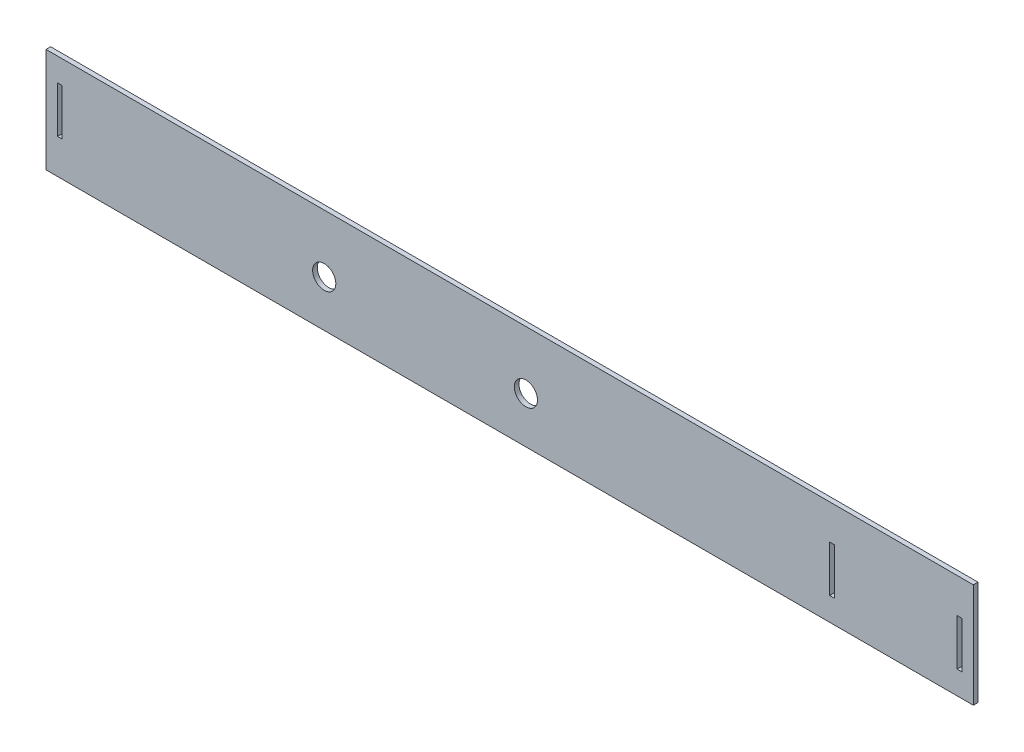
ISO-10303-21;
HEADER;
FILE_DESCRIPTION(('STEP AP214'),'2;1');
FILE_NAME('part.step','',(''),(''),'','','');
FILE_SCHEMA(('AUTOMOTIVE_DESIGN { 1 0 10303 214 1 1 1 1 }'));
ENDSEC;
DATA;
#1=APPLICATION_CONTEXT('core data for automotive mechanical design processes');
#2=APPLICATION_PROTOCOL_DEFINITION('international standard','automotive_design',2000,#1);
#3=PRODUCT_CONTEXT('',#1,'mechanical');
#4=PRODUCT('Part','Part','',(#3));
#5=PRODUCT_RELATED_PRODUCT_CATEGORY('part','',(#4));
#6=PRODUCT_DEFINITION_FORMATION('','',#4);
#7=PRODUCT_DEFINITION_CONTEXT('part definition',#1,'design');
#8=PRODUCT_DEFINITION('design','',#6,#7);
#9=PRODUCT_DEFINITION_SHAPE('','',#8);
#10=(LENGTH_UNIT() NAMED_UNIT(*) SI_UNIT(.MILLI.,.METRE.));
#11=(NAMED_UNIT(*) PLANE_ANGLE_UNIT() SI_UNIT($,.RADIAN.));
#12=(NAMED_UNIT(*) SI_UNIT($,.STERADIAN.) SOLID_ANGLE_UNIT());
#13=UNCERTAINTY_MEASURE_WITH_UNIT(LENGTH_MEASURE(1.E-05),#10,'distance_accuracy_value','');
#14=(GEOMETRIC_REPRESENTATION_CONTEXT(3) GLOBAL_UNCERTAINTY_ASSIGNED_CONTEXT((#13)) GLOBAL_UNIT_ASSIGNED_CONTEXT((#10,
#11,#12)) REPRESENTATION_CONTEXT('',''));
#15=CARTESIAN_POINT('',(0.,0.,0.));
#16=DIRECTION('',(0.,0.,1.));
#17=DIRECTION('',(1.,0.,0.));
#18=AXIS2_PLACEMENT_3D('',#15,#16,#17);
#19=CARTESIAN_POINT('',(0.,0.,2.));
#20=DIRECTION('',(0.,0.,-1.));
#21=DIRECTION('',(-1.,0.,0.));
#22=AXIS2_PLACEMENT_3D('',#19,#20,#21);
#23=PLANE('',#22);
#24=DIRECTION('',(0.,-1.,0.));
#25=VECTOR('',#24,1.);
#26=CARTESIAN_POINT('',(393.,30.,2.));
#27=LINE('',#26,#25);
#28=CARTESIAN_POINT('',(393.,30.,2.));
#29=VERTEX_POINT('',#28);
#30=CARTESIAN_POINT('',(393.,10.,2.));
#31=VERTEX_POINT('',#30);
#32=EDGE_CURVE('E184',#29,#31,#27,.T.);
#33=ORIENTED_EDGE('',*,*,#32,.F.);
#34=DIRECTION('',(-1.,0.,0.));
#35=VECTOR('',#34,1.);
#36=CARTESIAN_POINT('',(393.,30.,2.));
#37=LINE('',#36,#35);
#38=CARTESIAN_POINT('',(395.,30.,2.));
#39=VERTEX_POINT('',#38);
#40=EDGE_CURVE('E192',#39,#29,#37,.T.);
#41=ORIENTED_EDGE('',*,*,#40,.F.);
#42=DIRECTION('',(0.,1.,0.));
#43=VECTOR('',#42,1.);
#44=CARTESIAN_POINT('',(395.,30.,2.));
#45=LINE('',#44,#43);
#46=CARTESIAN_POINT('',(395.,10.,2.));
#47=VERTEX_POINT('',#46);
#48=EDGE_CURVE('E189',#47,#39,#45,.T.);
#49=ORIENTED_EDGE('',*,*,#48,.F.);
#50=DIRECTION('',(1.,0.,0.));
#51=VECTOR('',#50,1.);
#52=CARTESIAN_POINT('',(393.,10.,2.));
#53=LINE('',#52,#51);
#54=EDGE_CURVE('E186',#31,#47,#53,.T.);
#55=ORIENTED_EDGE('',*,*,#54,.F.);
#56=EDGE_LOOP('',(#33,#41,#49,#55));
#57=FACE_BOUND('',#56,.T.);
#58=CARTESIAN_POINT('',(207.,20.,2.));
#59=DIRECTION('',(0.,0.,1.));
#60=DIRECTION('',(1.,0.,0.));
#61=AXIS2_PLACEMENT_3D('',#58,#59,#60);
#62=CIRCLE('',#61,4.99999999999999);
#63=CARTESIAN_POINT('',(212.,20.,2.));
#64=VERTEX_POINT('',#63);
#65=EDGE_CURVE('E246',#64,#64,#62,.T.);
#66=ORIENTED_EDGE('',*,*,#65,.F.);
#67=EDGE_LOOP('',(#66));
#68=FACE_BOUND('',#67,.T.);
#69=CARTESIAN_POINT('',(120.,20.,2.));
#70=DIRECTION('',(0.,0.,1.));
#71=DIRECTION('',(1.,0.,0.));
#72=AXIS2_PLACEMENT_3D('',#69,#70,#71);
#73=CIRCLE('',#72,4.99999999999999);
#74=CARTESIAN_POINT('',(125.,20.,2.));
#75=VERTEX_POINT('',#74);
#76=EDGE_CURVE('E252',#75,#75,#73,.T.);
#77=ORIENTED_EDGE('',*,*,#76,.F.);
#78=EDGE_LOOP('',(#77));
#79=FACE_BOUND('',#78,.T.);
#80=DIRECTION('',(0.,-1.,0.));
#81=VECTOR('',#80,1.);
#82=CARTESIAN_POINT('',(0.,0.,2.));
#83=LINE('',#82,#81);
#84=CARTESIAN_POINT('',(0.,45.,2.));
#85=VERTEX_POINT('',#84);
#86=CARTESIAN_POINT('',(0.,0.,2.));
#87=VERTEX_POINT('',#86);
#88=EDGE_CURVE('E258',#85,#87,#83,.T.);
#89=ORIENTED_EDGE('',*,*,#88,.T.);
#90=DIRECTION('',(1.,0.,0.));
#91=VECTOR('',#90,1.);
#92=CARTESIAN_POINT('',(0.,0.,2.));
#93=LINE('',#92,#91);
#94=CARTESIAN_POINT('',(400.,0.,2.));
#95=VERTEX_POINT('',#94);
#96=EDGE_CURVE('E261',#87,#95,#93,.T.);
#97=ORIENTED_EDGE('',*,*,#96,.T.);
#98=DIRECTION('',(0.,1.,0.));
#99=VECTOR('',#98,1.);
#100=CARTESIAN_POINT('',(400.,0.,2.));
#101=LINE('',#100,#99);
#102=CARTESIAN_POINT('',(400.,45.,2.));
#103=VERTEX_POINT('',#102);
#104=EDGE_CURVE('E264',#95,#103,#101,.T.);
#105=ORIENTED_EDGE('',*,*,#104,.T.);
#106=DIRECTION('',(-1.,0.,0.));
#107=VECTOR('',#106,1.);
#108=CARTESIAN_POINT('',(0.,45.,2.));
#109=LINE('',#108,#107);
#110=EDGE_CURVE('E266',#103,#85,#109,.T.);
#111=ORIENTED_EDGE('',*,*,#110,.T.);
#112=EDGE_LOOP('',(#89,#97,#105,#111));
#113=FACE_BOUND('',#112,.T.);
#114=DIRECTION('',(0.,-1.,0.));
#115=VECTOR('',#114,1.);
#116=CARTESIAN_POINT('',(338.,30.,2.));
#117=LINE('',#116,#115);
#118=CARTESIAN_POINT('',(338.,30.,2.));
#119=VERTEX_POINT('',#118);
#120=CARTESIAN_POINT('',(338.,10.,2.));
#121=VERTEX_POINT('',#120);
#122=EDGE_CURVE('E215',#119,#121,#117,.T.);
#123=ORIENTED_EDGE('',*,*,#122,.F.);
#124=DIRECTION('',(-1.,0.,0.));
#125=VECTOR('',#124,1.);
#126=CARTESIAN_POINT('',(338.,30.,2.));
#127=LINE('',#126,#125);
#128=CARTESIAN_POINT('',(340.,30.,2.));
#129=VERTEX_POINT('',#128);
#130=EDGE_CURVE('E223',#129,#119,#127,.T.);
#131=ORIENTED_EDGE('',*,*,#130,.F.);
#132=DIRECTION('',(0.,1.,0.));
#133=VECTOR('',#132,1.);
#134=CARTESIAN_POINT('',(340.,30.,2.));
#135=LINE('',#134,#133);
#136=CARTESIAN_POINT('',(340.,10.,2.));
#137=VERTEX_POINT('',#136);
#138=EDGE_CURVE('E220',#137,#129,#135,.T.);
#139=ORIENTED_EDGE('',*,*,#138,.F.);
#140=DIRECTION('',(1.,0.,0.));
#141=VECTOR('',#140,1.);
#142=CARTESIAN_POINT('',(338.,10.,2.));
#143=LINE('',#142,#141);
#144=EDGE_CURVE('E217',#121,#137,#143,.T.);
#145=ORIENTED_EDGE('',*,*,#144,.F.);
#146=EDGE_LOOP('',(#123,#131,#139,#145));
#147=FACE_BOUND('',#146,.T.);
#148=DIRECTION('',(0.,-1.,0.));
#149=VECTOR('',#148,1.);
#150=CARTESIAN_POINT('',(5.,35.,2.));
#151=LINE('',#150,#149);
#152=CARTESIAN_POINT('',(5.,35.,2.));
#153=VERTEX_POINT('',#152);
#154=CARTESIAN_POINT('',(5.,15.,2.));
#155=VERTEX_POINT('',#154);
#156=EDGE_CURVE('E148',#153,#155,#151,.T.);
#157=ORIENTED_EDGE('',*,*,#156,.F.);
#158=DIRECTION('',(-1.,0.,0.));
#159=VECTOR('',#158,1.);
#160=CARTESIAN_POINT('',(5.,35.,2.));
#161=LINE('',#160,#159);
#162=CARTESIAN_POINT('',(7.,35.,2.));
#163=VERTEX_POINT('',#162);
#164=EDGE_CURVE('E170',#163,#153,#161,.T.);
#165=ORIENTED_EDGE('',*,*,#164,.F.);
#166=DIRECTION('',(0.,1.,0.));
#167=VECTOR('',#166,1.);
#168=CARTESIAN_POINT('',(7.,35.,2.));
#169=LINE('',#168,#167);
#170=CARTESIAN_POINT('',(7.,15.,2.));
#171=VERTEX_POINT('',#170);
#172=EDGE_CURVE('E168',#171,#163,#169,.T.);
#173=ORIENTED_EDGE('',*,*,#172,.F.);
#174=DIRECTION('',(1.,0.,0.));
#175=VECTOR('',#174,1.);
#176=CARTESIAN_POINT('',(5.,15.,2.));
#177=LINE('',#176,#175);
#178=EDGE_CURVE('E156',#155,#171,#177,.T.);
#179=ORIENTED_EDGE('',*,*,#178,.F.);
#180=EDGE_LOOP('',(#157,#165,#173,#179));
#181=FACE_BOUND('',#180,.T.);
#182=ADVANCED_FACE('F35',(#57,#68,#79,#113,#147,#181),#23,.F.);
#183=CARTESIAN_POINT('',(0.,0.,0.));
#184=DIRECTION('',(0.,0.,-1.));
#185=DIRECTION('',(-1.,0.,0.));
#186=AXIS2_PLACEMENT_3D('',#183,#184,#185);
#187=PLANE('',#186);
#188=CARTESIAN_POINT('',(120.,20.,0.));
#189=DIRECTION('',(0.,0.,1.));
#190=DIRECTION('',(1.,0.,0.));
#191=AXIS2_PLACEMENT_3D('',#188,#189,#190);
#192=CIRCLE('',#191,4.99999999999999);
#193=CARTESIAN_POINT('',(125.,20.,0.));
#194=VERTEX_POINT('',#193);
#195=EDGE_CURVE('E249',#194,#194,#192,.T.);
#196=ORIENTED_EDGE('',*,*,#195,.T.);
#197=EDGE_LOOP('',(#196));
#198=FACE_BOUND('',#197,.T.);
#199=DIRECTION('',(0.,-1.,0.));
#200=VECTOR('',#199,1.);
#201=CARTESIAN_POINT('',(0.,0.,0.));
#202=LINE('',#201,#200);
#203=CARTESIAN_POINT('',(0.,45.,0.));
#204=VERTEX_POINT('',#203);
#205=CARTESIAN_POINT('',(0.,0.,0.));
#206=VERTEX_POINT('',#205);
#207=EDGE_CURVE('E255',#204,#206,#202,.T.);
#208=ORIENTED_EDGE('',*,*,#207,.F.);
#209=DIRECTION('',(-1.,0.,0.));
#210=VECTOR('',#209,1.);
#211=CARTESIAN_POINT('',(0.,45.,0.));
#212=LINE('',#211,#210);
#213=CARTESIAN_POINT('',(400.,45.,0.));
#214=VERTEX_POINT('',#213);
#215=EDGE_CURVE('E262',#214,#204,#212,.T.);
#216=ORIENTED_EDGE('',*,*,#215,.F.);
#217=DIRECTION('',(0.,1.,0.));
#218=VECTOR('',#217,1.);
#219=CARTESIAN_POINT('',(400.,0.,0.));
#220=LINE('',#219,#218);
#221=CARTESIAN_POINT('',(400.,0.,0.));
#222=VERTEX_POINT('',#221);
#223=EDGE_CURVE('E273',#222,#214,#220,.T.);
#224=ORIENTED_EDGE('',*,*,#223,.F.);
#225=DIRECTION('',(1.,0.,0.));
#226=VECTOR('',#225,1.);
#227=CARTESIAN_POINT('',(0.,0.,0.));
#228=LINE('',#227,#226);
#229=EDGE_CURVE('E271',#206,#222,#228,.T.);
#230=ORIENTED_EDGE('',*,*,#229,.F.);
#231=EDGE_LOOP('',(#208,#216,#224,#230));
#232=FACE_BOUND('',#231,.T.);
#233=CARTESIAN_POINT('',(207.,20.,0.));
#234=DIRECTION('',(0.,0.,1.));
#235=DIRECTION('',(1.,0.,0.));
#236=AXIS2_PLACEMENT_3D('',#233,#234,#235);
#237=CIRCLE('',#236,4.99999999999999);
#238=CARTESIAN_POINT('',(212.,20.,0.));
#239=VERTEX_POINT('',#238);
#240=EDGE_CURVE('E245',#239,#239,#237,.T.);
#241=ORIENTED_EDGE('',*,*,#240,.T.);
#242=EDGE_LOOP('',(#241));
#243=FACE_BOUND('',#242,.T.);
#244=DIRECTION('',(-1.,0.,0.));
#245=VECTOR('',#244,1.);
#246=CARTESIAN_POINT('',(338.,30.,0.));
#247=LINE('',#246,#245);
#248=CARTESIAN_POINT('',(340.,30.,0.));
#249=VERTEX_POINT('',#248);
#250=CARTESIAN_POINT('',(338.,30.,0.));
#251=VERTEX_POINT('',#250);
#252=EDGE_CURVE('E218',#249,#251,#247,.T.);
#253=ORIENTED_EDGE('',*,*,#252,.T.);
#254=DIRECTION('',(0.,-1.,0.));
#255=VECTOR('',#254,1.);
#256=CARTESIAN_POINT('',(338.,30.,0.));
#257=LINE('',#256,#255);
#258=CARTESIAN_POINT('',(338.,10.,0.));
#259=VERTEX_POINT('',#258);
#260=EDGE_CURVE('E214',#251,#259,#257,.T.);
#261=ORIENTED_EDGE('',*,*,#260,.T.);
#262=DIRECTION('',(1.,0.,0.));
#263=VECTOR('',#262,1.);
#264=CARTESIAN_POINT('',(338.,10.,0.));
#265=LINE('',#264,#263);
#266=CARTESIAN_POINT('',(340.,10.,0.));
#267=VERTEX_POINT('',#266);
#268=EDGE_CURVE('E228',#259,#267,#265,.T.);
#269=ORIENTED_EDGE('',*,*,#268,.T.);
#270=DIRECTION('',(0.,1.,0.));
#271=VECTOR('',#270,1.);
#272=CARTESIAN_POINT('',(340.,30.,0.));
#273=LINE('',#272,#271);
#274=EDGE_CURVE('E231',#267,#249,#273,.T.);
#275=ORIENTED_EDGE('',*,*,#274,.T.);
#276=EDGE_LOOP('',(#253,#261,#269,#275));
#277=FACE_BOUND('',#276,.T.);
#278=DIRECTION('',(-1.,0.,0.));
#279=VECTOR('',#278,1.);
#280=CARTESIAN_POINT('',(393.,30.,0.));
#281=LINE('',#280,#279);
#282=CARTESIAN_POINT('',(395.,30.,0.));
#283=VERTEX_POINT('',#282);
#284=CARTESIAN_POINT('',(393.,30.,0.));
#285=VERTEX_POINT('',#284);
#286=EDGE_CURVE('E187',#283,#285,#281,.T.);
#287=ORIENTED_EDGE('',*,*,#286,.T.);
#288=DIRECTION('',(0.,-1.,0.));
#289=VECTOR('',#288,1.);
#290=CARTESIAN_POINT('',(393.,30.,0.));
#291=LINE('',#290,#289);
#292=CARTESIAN_POINT('',(393.,10.,0.));
#293=VERTEX_POINT('',#292);
#294=EDGE_CURVE('E164',#285,#293,#291,.T.);
#295=ORIENTED_EDGE('',*,*,#294,.T.);
#296=DIRECTION('',(1.,0.,0.));
#297=VECTOR('',#296,1.);
#298=CARTESIAN_POINT('',(393.,10.,0.));
#299=LINE('',#298,#297);
#300=CARTESIAN_POINT('',(395.,10.,0.));
#301=VERTEX_POINT('',#300);
#302=EDGE_CURVE('E197',#293,#301,#299,.T.);
#303=ORIENTED_EDGE('',*,*,#302,.T.);
#304=DIRECTION('',(0.,1.,0.));
#305=VECTOR('',#304,1.);
#306=CARTESIAN_POINT('',(395.,30.,0.));
#307=LINE('',#306,#305);
#308=EDGE_CURVE('E200',#301,#283,#307,.T.);
#309=ORIENTED_EDGE('',*,*,#308,.T.);
#310=EDGE_LOOP('',(#287,#295,#303,#309));
#311=FACE_BOUND('',#310,.T.);
#312=DIRECTION('',(-1.,0.,0.));
#313=VECTOR('',#312,1.);
#314=CARTESIAN_POINT('',(5.,35.,0.));
#315=LINE('',#314,#313);
#316=CARTESIAN_POINT('',(7.,35.,0.));
#317=VERTEX_POINT('',#316);
#318=CARTESIAN_POINT('',(5.,35.,0.));
#319=VERTEX_POINT('',#318);
#320=EDGE_CURVE('E157',#317,#319,#315,.T.);
#321=ORIENTED_EDGE('',*,*,#320,.T.);
#322=DIRECTION('',(0.,-1.,0.));
#323=VECTOR('',#322,1.);
#324=CARTESIAN_POINT('',(5.,35.,0.));
#325=LINE('',#324,#323);
#326=CARTESIAN_POINT('',(5.,15.,0.));
#327=VERTEX_POINT('',#326);
#328=EDGE_CURVE('E58',#319,#327,#325,.T.);
#329=ORIENTED_EDGE('',*,*,#328,.T.);
#330=DIRECTION('',(1.,0.,0.));
#331=VECTOR('',#330,1.);
#332=CARTESIAN_POINT('',(5.,15.,0.));
#333=LINE('',#332,#331);
#334=CARTESIAN_POINT('',(7.,15.,0.));
#335=VERTEX_POINT('',#334);
#336=EDGE_CURVE('E163',#327,#335,#333,.T.);
#337=ORIENTED_EDGE('',*,*,#336,.T.);
#338=DIRECTION('',(0.,1.,0.));
#339=VECTOR('',#338,1.);
#340=CARTESIAN_POINT('',(7.,35.,0.));
#341=LINE('',#340,#339);
#342=EDGE_CURVE('E176',#335,#317,#341,.T.);
#343=ORIENTED_EDGE('',*,*,#342,.T.);
#344=EDGE_LOOP('',(#321,#329,#337,#343));
#345=FACE_BOUND('',#344,.T.);
#346=ADVANCED_FACE('F291',(#198,#232,#243,#277,#311,#345),#187,.T.);
#347=CARTESIAN_POINT('',(0.,0.,2.));
#348=DIRECTION('',(1.,0.,0.));
#349=DIRECTION('',(0.,0.,-1.));
#350=AXIS2_PLACEMENT_3D('',#347,#348,#349);
#351=PLANE('',#350);
#352=ORIENTED_EDGE('',*,*,#207,.T.);
#353=DIRECTION('',(0.,0.,-1.));
#354=VECTOR('',#353,1.);
#355=CARTESIAN_POINT('',(0.,0.,2.));
#356=LINE('',#355,#354);
#357=EDGE_CURVE('E11',#87,#206,#356,.T.);
#358=ORIENTED_EDGE('',*,*,#357,.F.);
#359=ORIENTED_EDGE('',*,*,#88,.F.);
#360=DIRECTION('',(0.,0.,-1.));
#361=VECTOR('',#360,1.);
#362=CARTESIAN_POINT('',(0.,45.,2.));
#363=LINE('',#362,#361);
#364=EDGE_CURVE('E268',#85,#204,#363,.T.);
#365=ORIENTED_EDGE('',*,*,#364,.T.);
#366=EDGE_LOOP('',(#352,#358,#359,#365));
#367=FACE_BOUND('',#366,.T.);
#368=ADVANCED_FACE('F37',(#367),#351,.F.);
#369=CARTESIAN_POINT('',(0.,0.,2.));
#370=DIRECTION('',(0.,1.,0.));
#371=DIRECTION('',(0.,0.,1.));
#372=AXIS2_PLACEMENT_3D('',#369,#370,#371);
#373=PLANE('',#372);
#374=ORIENTED_EDGE('',*,*,#229,.T.);
#375=DIRECTION('',(0.,0.,-1.));
#376=VECTOR('',#375,1.);
#377=CARTESIAN_POINT('',(400.,0.,2.));
#378=LINE('',#377,#376);
#379=EDGE_CURVE('E43',#95,#222,#378,.T.);
#380=ORIENTED_EDGE('',*,*,#379,.F.);
#381=ORIENTED_EDGE('',*,*,#96,.F.);
#382=ORIENTED_EDGE('',*,*,#357,.T.);
#383=EDGE_LOOP('',(#374,#380,#381,#382));
#384=FACE_BOUND('',#383,.T.);
#385=ADVANCED_FACE('F302',(#384),#373,.F.);
#386=CARTESIAN_POINT('',(400.,0.,2.));
#387=DIRECTION('',(-1.,0.,0.));
#388=DIRECTION('',(0.,0.,1.));
#389=AXIS2_PLACEMENT_3D('',#386,#387,#388);
#390=PLANE('',#389);
#391=ORIENTED_EDGE('',*,*,#223,.T.);
#392=DIRECTION('',(0.,0.,-1.));
#393=VECTOR('',#392,1.);
#394=CARTESIAN_POINT('',(400.,45.,2.));
#395=LINE('',#394,#393);
#396=EDGE_CURVE('E278',#103,#214,#395,.T.);
#397=ORIENTED_EDGE('',*,*,#396,.F.);
#398=ORIENTED_EDGE('',*,*,#104,.F.);
#399=ORIENTED_EDGE('',*,*,#379,.T.);
#400=EDGE_LOOP('',(#391,#397,#398,#399));
#401=FACE_BOUND('',#400,.T.);
#402=ADVANCED_FACE('F285',(#401),#390,.F.);
#403=CARTESIAN_POINT('',(0.,45.,2.));
#404=DIRECTION('',(0.,-1.,0.));
#405=DIRECTION('',(0.,0.,-1.));
#406=AXIS2_PLACEMENT_3D('',#403,#404,#405);
#407=PLANE('',#406);
#408=ORIENTED_EDGE('',*,*,#215,.T.);
#409=ORIENTED_EDGE('',*,*,#364,.F.);
#410=ORIENTED_EDGE('',*,*,#110,.F.);
#411=ORIENTED_EDGE('',*,*,#396,.T.);
#412=EDGE_LOOP('',(#408,#409,#410,#411));
#413=FACE_BOUND('',#412,.T.);
#414=ADVANCED_FACE('F295',(#413),#407,.F.);
#415=CARTESIAN_POINT('',(120.,20.,2.));
#416=DIRECTION('',(0.,0.,-1.));
#417=DIRECTION('',(-1.,0.,0.));
#418=AXIS2_PLACEMENT_3D('',#415,#416,#417);
#419=CYLINDRICAL_SURFACE('',#418,4.99999999999999);
#420=ORIENTED_EDGE('',*,*,#76,.T.);
#421=EDGE_LOOP('',(#420));
#422=FACE_BOUND('',#421,.T.);
#423=ORIENTED_EDGE('',*,*,#195,.F.);
#424=EDGE_LOOP('',(#423));
#425=FACE_BOUND('',#424,.T.);
#426=ADVANCED_FACE('F320',(#422,#425),#419,.F.);
#427=CARTESIAN_POINT('',(207.,20.,2.));
#428=DIRECTION('',(0.,0.,-1.));
#429=DIRECTION('',(-1.,0.,0.));
#430=AXIS2_PLACEMENT_3D('',#427,#428,#429);
#431=CYLINDRICAL_SURFACE('',#430,4.99999999999999);
#432=ORIENTED_EDGE('',*,*,#65,.T.);
#433=EDGE_LOOP('',(#432));
#434=FACE_BOUND('',#433,.T.);
#435=ORIENTED_EDGE('',*,*,#240,.F.);
#436=EDGE_LOOP('',(#435));
#437=FACE_BOUND('',#436,.T.);
#438=ADVANCED_FACE('F327',(#434,#437),#431,.F.);
#439=CARTESIAN_POINT('',(338.,30.,2.));
#440=DIRECTION('',(1.,0.,0.));
#441=DIRECTION('',(0.,0.,-1.));
#442=AXIS2_PLACEMENT_3D('',#439,#440,#441);
#443=PLANE('',#442);
#444=ORIENTED_EDGE('',*,*,#260,.F.);
#445=DIRECTION('',(0.,0.,-1.));
#446=VECTOR('',#445,1.);
#447=CARTESIAN_POINT('',(338.,30.,2.));
#448=LINE('',#447,#446);
#449=EDGE_CURVE('E225',#119,#251,#448,.T.);
#450=ORIENTED_EDGE('',*,*,#449,.F.);
#451=ORIENTED_EDGE('',*,*,#122,.T.);
#452=DIRECTION('',(0.,0.,-1.));
#453=VECTOR('',#452,1.);
#454=CARTESIAN_POINT('',(338.,10.,2.));
#455=LINE('',#454,#453);
#456=EDGE_CURVE('E242',#121,#259,#455,.T.);
#457=ORIENTED_EDGE('',*,*,#456,.T.);
#458=EDGE_LOOP('',(#444,#450,#451,#457));
#459=FACE_BOUND('',#458,.T.);
#460=ADVANCED_FACE('F332',(#459),#443,.T.);
#461=CARTESIAN_POINT('',(338.,10.,2.));
#462=DIRECTION('',(0.,1.,0.));
#463=DIRECTION('',(-1.,0.,0.));
#464=AXIS2_PLACEMENT_3D('',#461,#462,#463);
#465=PLANE('',#464);
#466=ORIENTED_EDGE('',*,*,#268,.F.);
#467=ORIENTED_EDGE('',*,*,#456,.F.);
#468=ORIENTED_EDGE('',*,*,#144,.T.);
#469=DIRECTION('',(0.,0.,-1.));
#470=VECTOR('',#469,1.);
#471=CARTESIAN_POINT('',(340.,10.,2.));
#472=LINE('',#471,#470);
#473=EDGE_CURVE('E240',#137,#267,#472,.T.);
#474=ORIENTED_EDGE('',*,*,#473,.T.);
#475=EDGE_LOOP('',(#466,#467,#468,#474));
#476=FACE_BOUND('',#475,.T.);
#477=ADVANCED_FACE('F341',(#476),#465,.T.);
#478=CARTESIAN_POINT('',(340.,30.,2.));
#479=DIRECTION('',(-1.,0.,0.));
#480=DIRECTION('',(0.,0.,1.));
#481=AXIS2_PLACEMENT_3D('',#478,#479,#480);
#482=PLANE('',#481);
#483=ORIENTED_EDGE('',*,*,#274,.F.);
#484=ORIENTED_EDGE('',*,*,#473,.F.);
#485=ORIENTED_EDGE('',*,*,#138,.T.);
#486=DIRECTION('',(0.,0.,-1.));
#487=VECTOR('',#486,1.);
#488=CARTESIAN_POINT('',(340.,30.,2.));
#489=LINE('',#488,#487);
#490=EDGE_CURVE('E238',#129,#249,#489,.T.);
#491=ORIENTED_EDGE('',*,*,#490,.T.);
#492=EDGE_LOOP('',(#483,#484,#485,#491));
#493=FACE_BOUND('',#492,.T.);
#494=ADVANCED_FACE('F348',(#493),#482,.T.);
#495=CARTESIAN_POINT('',(338.,30.,2.));
#496=DIRECTION('',(0.,-1.,0.));
#497=DIRECTION('',(0.,0.,-1.));
#498=AXIS2_PLACEMENT_3D('',#495,#496,#497);
#499=PLANE('',#498);
#500=ORIENTED_EDGE('',*,*,#252,.F.);
#501=ORIENTED_EDGE('',*,*,#490,.F.);
#502=ORIENTED_EDGE('',*,*,#130,.T.);
#503=ORIENTED_EDGE('',*,*,#449,.T.);
#504=EDGE_LOOP('',(#500,#501,#502,#503));
#505=FACE_BOUND('',#504,.T.);
#506=ADVANCED_FACE('F352',(#505),#499,.T.);
#507=CARTESIAN_POINT('',(393.,30.,2.));
#508=DIRECTION('',(1.,0.,0.));
#509=DIRECTION('',(0.,0.,-1.));
#510=AXIS2_PLACEMENT_3D('',#507,#508,#509);
#511=PLANE('',#510);
#512=ORIENTED_EDGE('',*,*,#294,.F.);
#513=DIRECTION('',(0.,0.,-1.));
#514=VECTOR('',#513,1.);
#515=CARTESIAN_POINT('',(393.,30.,2.));
#516=LINE('',#515,#514);
#517=EDGE_CURVE('E194',#29,#285,#516,.T.);
#518=ORIENTED_EDGE('',*,*,#517,.F.);
#519=ORIENTED_EDGE('',*,*,#32,.T.);
#520=DIRECTION('',(0.,0.,-1.));
#521=VECTOR('',#520,1.);
#522=CARTESIAN_POINT('',(393.,10.,2.));
#523=LINE('',#522,#521);
#524=EDGE_CURVE('E211',#31,#293,#523,.T.);
#525=ORIENTED_EDGE('',*,*,#524,.T.);
#526=EDGE_LOOP('',(#512,#518,#519,#525));
#527=FACE_BOUND('',#526,.T.);
#528=ADVANCED_FACE('F356',(#527),#511,.T.);
#529=CARTESIAN_POINT('',(393.,10.,2.));
#530=DIRECTION('',(0.,1.,0.));
#531=DIRECTION('',(0.,0.,1.));
#532=AXIS2_PLACEMENT_3D('',#529,#530,#531);
#533=PLANE('',#532);
#534=ORIENTED_EDGE('',*,*,#302,.F.);
#535=ORIENTED_EDGE('',*,*,#524,.F.);
#536=ORIENTED_EDGE('',*,*,#54,.T.);
#537=DIRECTION('',(0.,0.,-1.));
#538=VECTOR('',#537,1.);
#539=CARTESIAN_POINT('',(395.,10.,2.));
#540=LINE('',#539,#538);
#541=EDGE_CURVE('E209',#47,#301,#540,.T.);
#542=ORIENTED_EDGE('',*,*,#541,.T.);
#543=EDGE_LOOP('',(#534,#535,#536,#542));
#544=FACE_BOUND('',#543,.T.);
#545=ADVANCED_FACE('F360',(#544),#533,.T.);
#546=CARTESIAN_POINT('',(395.,30.,2.));
#547=DIRECTION('',(-1.,0.,0.));
#548=DIRECTION('',(0.,0.,1.));
#549=AXIS2_PLACEMENT_3D('',#546,#547,#548);
#550=PLANE('',#549);
#551=ORIENTED_EDGE('',*,*,#308,.F.);
#552=ORIENTED_EDGE('',*,*,#541,.F.);
#553=ORIENTED_EDGE('',*,*,#48,.T.);
#554=DIRECTION('',(0.,0.,-1.));
#555=VECTOR('',#554,1.);
#556=CARTESIAN_POINT('',(395.,30.,2.));
#557=LINE('',#556,#555);
#558=EDGE_CURVE('E207',#39,#283,#557,.T.);
#559=ORIENTED_EDGE('',*,*,#558,.T.);
#560=EDGE_LOOP('',(#551,#552,#553,#559));
#561=FACE_BOUND('',#560,.T.);
#562=ADVANCED_FACE('F364',(#561),#550,.T.);
#563=CARTESIAN_POINT('',(393.,30.,2.));
#564=DIRECTION('',(0.,-1.,0.));
#565=DIRECTION('',(0.,0.,-1.));
#566=AXIS2_PLACEMENT_3D('',#563,#564,#565);
#567=PLANE('',#566);
#568=ORIENTED_EDGE('',*,*,#286,.F.);
#569=ORIENTED_EDGE('',*,*,#558,.F.);
#570=ORIENTED_EDGE('',*,*,#40,.T.);
#571=ORIENTED_EDGE('',*,*,#517,.T.);
#572=EDGE_LOOP('',(#568,#569,#570,#571));
#573=FACE_BOUND('',#572,.T.);
#574=ADVANCED_FACE('F368',(#573),#567,.T.);
#575=CARTESIAN_POINT('',(5.,35.,2.));
#576=DIRECTION('',(1.,0.,0.));
#577=DIRECTION('',(0.,1.,0.));
#578=AXIS2_PLACEMENT_3D('',#575,#576,#577);
#579=PLANE('',#578);
#580=ORIENTED_EDGE('',*,*,#328,.F.);
#581=DIRECTION('',(0.,0.,-1.));
#582=VECTOR('',#581,1.);
#583=CARTESIAN_POINT('',(5.,35.,2.));
#584=LINE('',#583,#582);
#585=EDGE_CURVE('E152',#153,#319,#584,.T.);
#586=ORIENTED_EDGE('',*,*,#585,.F.);
#587=ORIENTED_EDGE('',*,*,#156,.T.);
#588=DIRECTION('',(0.,0.,-1.));
#589=VECTOR('',#588,1.);
#590=CARTESIAN_POINT('',(5.,15.,2.));
#591=LINE('',#590,#589);
#592=EDGE_CURVE('E151',#155,#327,#591,.T.);
#593=ORIENTED_EDGE('',*,*,#592,.T.);
#594=EDGE_LOOP('',(#580,#586,#587,#593));
#595=FACE_BOUND('',#594,.T.);
#596=ADVANCED_FACE('F150',(#595),#579,.T.);
#597=CARTESIAN_POINT('',(5.,15.,2.));
#598=DIRECTION('',(0.,1.,0.));
#599=DIRECTION('',(0.,0.,1.));
#600=AXIS2_PLACEMENT_3D('',#597,#598,#599);
#601=PLANE('',#600);
#602=ORIENTED_EDGE('',*,*,#336,.F.);
#603=ORIENTED_EDGE('',*,*,#592,.F.);
#604=ORIENTED_EDGE('',*,*,#178,.T.);
#605=DIRECTION('',(0.,0.,-1.));
#606=VECTOR('',#605,1.);
#607=CARTESIAN_POINT('',(7.,15.,2.));
#608=LINE('',#607,#606);
#609=EDGE_CURVE('E165',#171,#335,#608,.T.);
#610=ORIENTED_EDGE('',*,*,#609,.T.);
#611=EDGE_LOOP('',(#602,#603,#604,#610));
#612=FACE_BOUND('',#611,.T.);
#613=ADVANCED_FACE('F160',(#612),#601,.T.);
#614=CARTESIAN_POINT('',(7.,35.,2.));
#615=DIRECTION('',(-1.,0.,0.));
#616=DIRECTION('',(0.,-1.,0.));
#617=AXIS2_PLACEMENT_3D('',#614,#615,#616);
#618=PLANE('',#617);
#619=ORIENTED_EDGE('',*,*,#342,.F.);
#620=ORIENTED_EDGE('',*,*,#609,.F.);
#621=ORIENTED_EDGE('',*,*,#172,.T.);
#622=DIRECTION('',(0.,0.,-1.));
#623=VECTOR('',#622,1.);
#624=CARTESIAN_POINT('',(7.,35.,2.));
#625=LINE('',#624,#623);
#626=EDGE_CURVE('E50',#163,#317,#625,.T.);
#627=ORIENTED_EDGE('',*,*,#626,.T.);
#628=EDGE_LOOP('',(#619,#620,#621,#627));
#629=FACE_BOUND('',#628,.T.);
#630=ADVANCED_FACE('F377',(#629),#618,.T.);
#631=CARTESIAN_POINT('',(5.,35.,2.));
#632=DIRECTION('',(0.,-1.,0.));
#633=DIRECTION('',(0.,0.,-1.));
#634=AXIS2_PLACEMENT_3D('',#631,#632,#633);
#635=PLANE('',#634);
#636=ORIENTED_EDGE('',*,*,#320,.F.);
#637=ORIENTED_EDGE('',*,*,#626,.F.);
#638=ORIENTED_EDGE('',*,*,#164,.T.);
#639=ORIENTED_EDGE('',*,*,#585,.T.);
#640=EDGE_LOOP('',(#636,#637,#638,#639));
#641=FACE_BOUND('',#640,.T.);
#642=ADVANCED_FACE('F380',(#641),#635,.T.);
#643=CLOSED_SHELL('',(#182,#346,#368,#385,#402,#414,#426,#438,#460,#477,#494,#506,#528,#545,
#562,#574,#596,#613,#630,#642));
#644=MANIFOLD_SOLID_BREP('B2',#643);
#645=ADVANCED_BREP_SHAPE_REPRESENTATION('',(#18,#644),#14);
#646=SHAPE_DEFINITION_REPRESENTATION(#9,#645);
ENDSEC;
END-ISO-10303-21;
